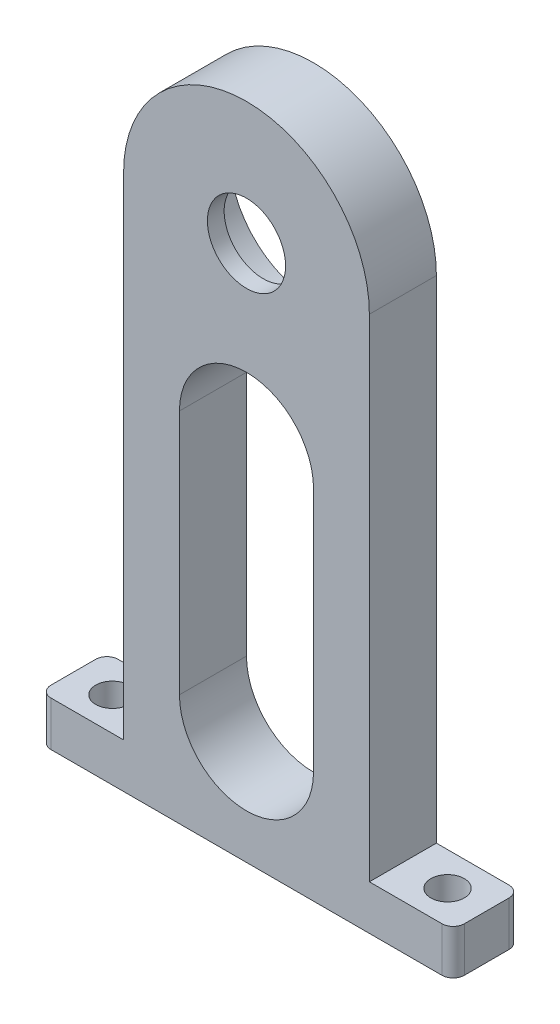
ISO-10303-21;
HEADER;
FILE_DESCRIPTION(('STEP AP214'),'2;1');
FILE_NAME('part.step','',(''),(''),'','','');
FILE_SCHEMA(('AUTOMOTIVE_DESIGN { 1 0 10303 214 1 1 1 1 }'));
ENDSEC;
DATA;
#1=APPLICATION_CONTEXT('core data for automotive mechanical design processes');
#2=APPLICATION_PROTOCOL_DEFINITION('international standard','automotive_design',2000,#1);
#3=PRODUCT_CONTEXT('',#1,'mechanical');
#4=PRODUCT('Part','Part','',(#3));
#5=PRODUCT_RELATED_PRODUCT_CATEGORY('part','',(#4));
#6=PRODUCT_DEFINITION_FORMATION('','',#4);
#7=PRODUCT_DEFINITION_CONTEXT('part definition',#1,'design');
#8=PRODUCT_DEFINITION('design','',#6,#7);
#9=PRODUCT_DEFINITION_SHAPE('','',#8);
#10=(LENGTH_UNIT() NAMED_UNIT(*) SI_UNIT(.MILLI.,.METRE.));
#11=(NAMED_UNIT(*) PLANE_ANGLE_UNIT() SI_UNIT($,.RADIAN.));
#12=(NAMED_UNIT(*) SI_UNIT($,.STERADIAN.) SOLID_ANGLE_UNIT());
#13=UNCERTAINTY_MEASURE_WITH_UNIT(LENGTH_MEASURE(1.E-05),#10,'distance_accuracy_value','');
#14=(GEOMETRIC_REPRESENTATION_CONTEXT(3) GLOBAL_UNCERTAINTY_ASSIGNED_CONTEXT((#13)) GLOBAL_UNIT_ASSIGNED_CONTEXT((#10,
#11,#12)) REPRESENTATION_CONTEXT('',''));
#15=CARTESIAN_POINT('',(0.,0.,0.));
#16=DIRECTION('',(0.,0.,1.));
#17=DIRECTION('',(1.,0.,0.));
#18=AXIS2_PLACEMENT_3D('',#15,#16,#17);
#19=CARTESIAN_POINT('',(22.,0.,12.));
#20=DIRECTION('',(1.,0.,0.));
#21=DIRECTION('',(0.,1.,0.));
#22=AXIS2_PLACEMENT_3D('',#19,#20,#21);
#23=PLANE('',#22);
#24=DIRECTION('',(0.,-1.,0.));
#25=VECTOR('',#24,1.);
#26=CARTESIAN_POINT('',(22.,0.,0.));
#27=LINE('',#26,#25);
#28=CARTESIAN_POINT('',(22.,0.,0.));
#29=VERTEX_POINT('',#28);
#30=CARTESIAN_POINT('',(22.,-88.,0.));
#31=VERTEX_POINT('',#30);
#32=EDGE_CURVE('E212',#29,#31,#27,.T.);
#33=ORIENTED_EDGE('',*,*,#32,.F.);
#34=DIRECTION('',(0.,0.,-1.));
#35=VECTOR('',#34,1.);
#36=CARTESIAN_POINT('',(22.,0.,12.));
#37=LINE('',#36,#35);
#38=CARTESIAN_POINT('',(22.,0.,12.));
#39=VERTEX_POINT('',#38);
#40=EDGE_CURVE('E244',#39,#29,#37,.T.);
#41=ORIENTED_EDGE('',*,*,#40,.F.);
#42=DIRECTION('',(0.,-1.,0.));
#43=VECTOR('',#42,1.);
#44=CARTESIAN_POINT('',(22.,0.,12.));
#45=LINE('',#44,#43);
#46=CARTESIAN_POINT('',(22.,-88.,12.));
#47=VERTEX_POINT('',#46);
#48=EDGE_CURVE('E183',#39,#47,#45,.T.);
#49=ORIENTED_EDGE('',*,*,#48,.T.);
#50=DIRECTION('',(0.,0.,-1.));
#51=VECTOR('',#50,1.);
#52=CARTESIAN_POINT('',(22.,-88.,12.));
#53=LINE('',#52,#51);
#54=EDGE_CURVE('E161',#47,#31,#53,.T.);
#55=ORIENTED_EDGE('',*,*,#54,.T.);
#56=EDGE_LOOP('',(#33,#41,#49,#55));
#57=FACE_BOUND('',#56,.T.);
#58=ADVANCED_FACE('F38',(#57),#23,.T.);
#59=CARTESIAN_POINT('',(0.,0.,12.));
#60=DIRECTION('',(0.,0.,-1.));
#61=DIRECTION('',(-1.,0.,0.));
#62=AXIS2_PLACEMENT_3D('',#59,#60,#61);
#63=CYLINDRICAL_SURFACE('',#62,22.);
#64=CARTESIAN_POINT('',(0.,0.,0.));
#65=DIRECTION('',(0.,0.,1.));
#66=DIRECTION('',(1.,0.,0.));
#67=AXIS2_PLACEMENT_3D('',#64,#65,#66);
#68=CIRCLE('',#67,22.);
#69=CARTESIAN_POINT('',(-22.,0.,0.));
#70=VERTEX_POINT('',#69);
#71=EDGE_CURVE('E215',#29,#70,#68,.T.);
#72=ORIENTED_EDGE('',*,*,#71,.T.);
#73=DIRECTION('',(0.,0.,-1.));
#74=VECTOR('',#73,1.);
#75=CARTESIAN_POINT('',(-22.,0.,12.));
#76=LINE('',#75,#74);
#77=CARTESIAN_POINT('',(-22.,0.,12.));
#78=VERTEX_POINT('',#77);
#79=EDGE_CURVE('E242',#78,#70,#76,.T.);
#80=ORIENTED_EDGE('',*,*,#79,.F.);
#81=CARTESIAN_POINT('',(0.,0.,12.));
#82=DIRECTION('',(0.,0.,1.));
#83=DIRECTION('',(1.,0.,0.));
#84=AXIS2_PLACEMENT_3D('',#81,#82,#83);
#85=CIRCLE('',#84,22.);
#86=EDGE_CURVE('E186',#39,#78,#85,.T.);
#87=ORIENTED_EDGE('',*,*,#86,.F.);
#88=ORIENTED_EDGE('',*,*,#40,.T.);
#89=EDGE_LOOP('',(#72,#80,#87,#88));
#90=FACE_BOUND('',#89,.T.);
#91=ADVANCED_FACE('F316',(#90),#63,.T.);
#92=CARTESIAN_POINT('',(-22.,0.,12.));
#93=DIRECTION('',(-1.,0.,0.));
#94=DIRECTION('',(0.,0.,1.));
#95=AXIS2_PLACEMENT_3D('',#92,#93,#94);
#96=PLANE('',#95);
#97=DIRECTION('',(0.,1.,0.));
#98=VECTOR('',#97,1.);
#99=CARTESIAN_POINT('',(-22.,0.,0.));
#100=LINE('',#99,#98);
#101=CARTESIAN_POINT('',(-22.,-88.,0.));
#102=VERTEX_POINT('',#101);
#103=EDGE_CURVE('E218',#102,#70,#100,.T.);
#104=ORIENTED_EDGE('',*,*,#103,.F.);
#105=DIRECTION('',(0.,0.,-1.));
#106=VECTOR('',#105,1.);
#107=CARTESIAN_POINT('',(-22.,-88.,12.));
#108=LINE('',#107,#106);
#109=CARTESIAN_POINT('',(-22.,-88.,12.));
#110=VERTEX_POINT('',#109);
#111=EDGE_CURVE('E239',#110,#102,#108,.T.);
#112=ORIENTED_EDGE('',*,*,#111,.F.);
#113=DIRECTION('',(0.,1.,0.));
#114=VECTOR('',#113,1.);
#115=CARTESIAN_POINT('',(-22.,0.,12.));
#116=LINE('',#115,#114);
#117=EDGE_CURVE('E188',#110,#78,#116,.T.);
#118=ORIENTED_EDGE('',*,*,#117,.T.);
#119=ORIENTED_EDGE('',*,*,#79,.T.);
#120=EDGE_LOOP('',(#104,#112,#118,#119));
#121=FACE_BOUND('',#120,.T.);
#122=ADVANCED_FACE('F321',(#121),#96,.T.);
#123=CARTESIAN_POINT('',(0.,-88.,12.));
#124=DIRECTION('',(0.,1.,0.));
#125=DIRECTION('',(0.,0.,1.));
#126=AXIS2_PLACEMENT_3D('',#123,#124,#125);
#127=PLANE('',#126);
#128=CARTESIAN_POINT('',(-30.,-88.,6.));
#129=DIRECTION('',(0.,1.,0.));
#130=DIRECTION('',(0.,0.,1.));
#131=AXIS2_PLACEMENT_3D('',#128,#129,#130);
#132=CIRCLE('',#131,3.);
#133=CARTESIAN_POINT('',(-30.,-88.,9.));
#134=VERTEX_POINT('',#133);
#135=EDGE_CURVE('E204',#134,#134,#132,.T.);
#136=ORIENTED_EDGE('',*,*,#135,.F.);
#137=EDGE_LOOP('',(#136));
#138=FACE_BOUND('',#137,.T.);
#139=DIRECTION('',(1.,0.,0.));
#140=VECTOR('',#139,1.);
#141=CARTESIAN_POINT('',(0.,-88.,0.));
#142=LINE('',#141,#140);
#143=CARTESIAN_POINT('',(-35.,-88.,0.));
#144=VERTEX_POINT('',#143);
#145=EDGE_CURVE('E221',#144,#102,#142,.T.);
#146=ORIENTED_EDGE('',*,*,#145,.F.);
#147=CARTESIAN_POINT('',(-35.,-88.,2.));
#148=DIRECTION('',(0.,1.,0.));
#149=DIRECTION('',(0.,0.,1.));
#150=AXIS2_PLACEMENT_3D('',#147,#148,#149);
#151=CIRCLE('',#150,2.);
#152=CARTESIAN_POINT('',(-37.,-88.,2.));
#153=VERTEX_POINT('',#152);
#154=EDGE_CURVE('E262',#144,#153,#151,.T.);
#155=ORIENTED_EDGE('',*,*,#154,.T.);
#156=DIRECTION('',(0.,0.,-1.));
#157=VECTOR('',#156,1.);
#158=CARTESIAN_POINT('',(-37.,-88.,12.));
#159=LINE('',#158,#157);
#160=CARTESIAN_POINT('',(-37.,-88.,10.));
#161=VERTEX_POINT('',#160);
#162=EDGE_CURVE('E236',#161,#153,#159,.T.);
#163=ORIENTED_EDGE('',*,*,#162,.F.);
#164=CARTESIAN_POINT('',(-35.,-88.,10.));
#165=DIRECTION('',(0.,1.,0.));
#166=DIRECTION('',(0.,0.,1.));
#167=AXIS2_PLACEMENT_3D('',#164,#165,#166);
#168=CIRCLE('',#167,2.);
#169=CARTESIAN_POINT('',(-35.,-88.,12.));
#170=VERTEX_POINT('',#169);
#171=EDGE_CURVE('E260',#161,#170,#168,.T.);
#172=ORIENTED_EDGE('',*,*,#171,.T.);
#173=DIRECTION('',(1.,0.,0.));
#174=VECTOR('',#173,1.);
#175=CARTESIAN_POINT('',(0.,-88.,12.));
#176=LINE('',#175,#174);
#177=EDGE_CURVE('E191',#170,#110,#176,.T.);
#178=ORIENTED_EDGE('',*,*,#177,.T.);
#179=ORIENTED_EDGE('',*,*,#111,.T.);
#180=EDGE_LOOP('',(#146,#155,#163,#172,#178,#179));
#181=FACE_BOUND('',#180,.T.);
#182=ADVANCED_FACE('F359',(#138,#181),#127,.T.);
#183=CARTESIAN_POINT('',(-37.,0.,12.));
#184=DIRECTION('',(-1.,0.,0.));
#185=DIRECTION('',(0.,0.,1.));
#186=AXIS2_PLACEMENT_3D('',#183,#184,#185);
#187=PLANE('',#186);
#188=ORIENTED_EDGE('',*,*,#162,.T.);
#189=DIRECTION('',(0.,1.,0.));
#190=VECTOR('',#189,1.);
#191=CARTESIAN_POINT('',(-37.,-96.,2.));
#192=LINE('',#191,#190);
#193=CARTESIAN_POINT('',(-37.,-96.,2.));
#194=VERTEX_POINT('',#193);
#195=EDGE_CURVE('E267',#153,#194,#192,.F.);
#196=ORIENTED_EDGE('',*,*,#195,.T.);
#197=DIRECTION('',(0.,0.,-1.));
#198=VECTOR('',#197,1.);
#199=CARTESIAN_POINT('',(-37.,-96.,12.));
#200=LINE('',#199,#198);
#201=CARTESIAN_POINT('',(-37.,-96.,10.));
#202=VERTEX_POINT('',#201);
#203=EDGE_CURVE('E233',#202,#194,#200,.T.);
#204=ORIENTED_EDGE('',*,*,#203,.F.);
#205=DIRECTION('',(0.,1.,0.));
#206=VECTOR('',#205,1.);
#207=CARTESIAN_POINT('',(-37.,0.,10.));
#208=LINE('',#207,#206);
#209=EDGE_CURVE('E264',#202,#161,#208,.T.);
#210=ORIENTED_EDGE('',*,*,#209,.T.);
#211=EDGE_LOOP('',(#188,#196,#204,#210));
#212=FACE_BOUND('',#211,.T.);
#213=ADVANCED_FACE('F354',(#212),#187,.T.);
#214=CARTESIAN_POINT('',(0.,-96.,12.));
#215=DIRECTION('',(0.,-1.,0.));
#216=DIRECTION('',(0.,0.,-1.));
#217=AXIS2_PLACEMENT_3D('',#214,#215,#216);
#218=PLANE('',#217);
#219=CARTESIAN_POINT('',(-30.,-96.,6.));
#220=DIRECTION('',(0.,-1.,0.));
#221=DIRECTION('',(0.,0.,-1.));
#222=AXIS2_PLACEMENT_3D('',#219,#220,#221);
#223=CIRCLE('',#222,3.);
#224=CARTESIAN_POINT('',(-30.,-96.,3.));
#225=VERTEX_POINT('',#224);
#226=EDGE_CURVE('E254',#225,#225,#223,.T.);
#227=ORIENTED_EDGE('',*,*,#226,.F.);
#228=EDGE_LOOP('',(#227));
#229=FACE_BOUND('',#228,.T.);
#230=CARTESIAN_POINT('',(30.,-96.,6.));
#231=DIRECTION('',(0.,-1.,0.));
#232=DIRECTION('',(0.,0.,-1.));
#233=AXIS2_PLACEMENT_3D('',#230,#231,#232);
#234=CIRCLE('',#233,3.);
#235=CARTESIAN_POINT('',(30.,-96.,3.));
#236=VERTEX_POINT('',#235);
#237=EDGE_CURVE('E413',#236,#236,#234,.T.);
#238=ORIENTED_EDGE('',*,*,#237,.F.);
#239=EDGE_LOOP('',(#238));
#240=FACE_BOUND('',#239,.T.);
#241=ORIENTED_EDGE('',*,*,#203,.T.);
#242=CARTESIAN_POINT('',(-35.,-96.,2.));
#243=DIRECTION('',(0.,-1.,0.));
#244=DIRECTION('',(0.,0.,-1.));
#245=AXIS2_PLACEMENT_3D('',#242,#243,#244);
#246=CIRCLE('',#245,2.);
#247=CARTESIAN_POINT('',(-35.,-96.,0.));
#248=VERTEX_POINT('',#247);
#249=EDGE_CURVE('E275',#194,#248,#246,.T.);
#250=ORIENTED_EDGE('',*,*,#249,.T.);
#251=DIRECTION('',(-1.,0.,0.));
#252=VECTOR('',#251,1.);
#253=CARTESIAN_POINT('',(0.,-96.,0.));
#254=LINE('',#253,#252);
#255=CARTESIAN_POINT('',(35.,-96.,0.));
#256=VERTEX_POINT('',#255);
#257=EDGE_CURVE('E223',#256,#248,#254,.T.);
#258=ORIENTED_EDGE('',*,*,#257,.F.);
#259=CARTESIAN_POINT('',(35.,-96.,2.));
#260=DIRECTION('',(0.,-1.,0.));
#261=DIRECTION('',(0.,0.,-1.));
#262=AXIS2_PLACEMENT_3D('',#259,#260,#261);
#263=CIRCLE('',#262,2.);
#264=CARTESIAN_POINT('',(37.,-96.,2.));
#265=VERTEX_POINT('',#264);
#266=EDGE_CURVE('E271',#256,#265,#263,.T.);
#267=ORIENTED_EDGE('',*,*,#266,.T.);
#268=DIRECTION('',(0.,0.,-1.));
#269=VECTOR('',#268,1.);
#270=CARTESIAN_POINT('',(37.,-96.,12.));
#271=LINE('',#270,#269);
#272=CARTESIAN_POINT('',(37.,-96.,10.));
#273=VERTEX_POINT('',#272);
#274=EDGE_CURVE('E231',#273,#265,#271,.T.);
#275=ORIENTED_EDGE('',*,*,#274,.F.);
#276=CARTESIAN_POINT('',(35.,-96.,10.));
#277=DIRECTION('',(0.,-1.,0.));
#278=DIRECTION('',(0.,0.,-1.));
#279=AXIS2_PLACEMENT_3D('',#276,#277,#278);
#280=CIRCLE('',#279,2.);
#281=CARTESIAN_POINT('',(35.,-96.,12.));
#282=VERTEX_POINT('',#281);
#283=EDGE_CURVE('E269',#273,#282,#280,.T.);
#284=ORIENTED_EDGE('',*,*,#283,.T.);
#285=DIRECTION('',(-1.,0.,0.));
#286=VECTOR('',#285,1.);
#287=CARTESIAN_POINT('',(0.,-96.,12.));
#288=LINE('',#287,#286);
#289=CARTESIAN_POINT('',(-35.,-96.,12.));
#290=VERTEX_POINT('',#289);
#291=EDGE_CURVE('E193',#282,#290,#288,.T.);
#292=ORIENTED_EDGE('',*,*,#291,.T.);
#293=CARTESIAN_POINT('',(-35.,-96.,10.));
#294=DIRECTION('',(0.,-1.,0.));
#295=DIRECTION('',(0.,0.,-1.));
#296=AXIS2_PLACEMENT_3D('',#293,#294,#295);
#297=CIRCLE('',#296,2.);
#298=EDGE_CURVE('E273',#290,#202,#297,.T.);
#299=ORIENTED_EDGE('',*,*,#298,.T.);
#300=EDGE_LOOP('',(#241,#250,#258,#267,#275,#284,#292,#299));
#301=FACE_BOUND('',#300,.T.);
#302=ADVANCED_FACE('F289',(#229,#240,#301),#218,.T.);
#303=CARTESIAN_POINT('',(37.0000000000001,0.,12.));
#304=DIRECTION('',(1.,0.,0.));
#305=DIRECTION('',(0.,1.,0.));
#306=AXIS2_PLACEMENT_3D('',#303,#304,#305);
#307=PLANE('',#306);
#308=ORIENTED_EDGE('',*,*,#274,.T.);
#309=DIRECTION('',(0.,-1.,0.));
#310=VECTOR('',#309,1.);
#311=CARTESIAN_POINT('',(37.,-88.,2.));
#312=LINE('',#311,#310);
#313=CARTESIAN_POINT('',(37.,-88.,2.));
#314=VERTEX_POINT('',#313);
#315=EDGE_CURVE('E53',#265,#314,#312,.F.);
#316=ORIENTED_EDGE('',*,*,#315,.T.);
#317=DIRECTION('',(0.,0.,-1.));
#318=VECTOR('',#317,1.);
#319=CARTESIAN_POINT('',(37.,-88.,12.));
#320=LINE('',#319,#318);
#321=CARTESIAN_POINT('',(37.,-88.,10.));
#322=VERTEX_POINT('',#321);
#323=EDGE_CURVE('E229',#322,#314,#320,.T.);
#324=ORIENTED_EDGE('',*,*,#323,.F.);
#325=DIRECTION('',(0.,-1.,0.));
#326=VECTOR('',#325,1.);
#327=CARTESIAN_POINT('',(37.0000000000001,0.,10.));
#328=LINE('',#327,#326);
#329=EDGE_CURVE('E281',#322,#273,#328,.T.);
#330=ORIENTED_EDGE('',*,*,#329,.T.);
#331=EDGE_LOOP('',(#308,#316,#324,#330));
#332=FACE_BOUND('',#331,.T.);
#333=ADVANCED_FACE('F286',(#332),#307,.T.);
#334=CARTESIAN_POINT('',(0.,-76.,12.));
#335=DIRECTION('',(0.,0.,-1.));
#336=DIRECTION('',(-1.,0.,0.));
#337=AXIS2_PLACEMENT_3D('',#334,#335,#336);
#338=CYLINDRICAL_SURFACE('',#337,12.);
#339=CARTESIAN_POINT('',(0.,-76.,0.));
#340=DIRECTION('',(0.,0.,1.));
#341=DIRECTION('',(1.,0.,0.));
#342=AXIS2_PLACEMENT_3D('',#339,#340,#341);
#343=CIRCLE('',#342,12.);
#344=CARTESIAN_POINT('',(-12.,-76.,0.));
#345=VERTEX_POINT('',#344);
#346=CARTESIAN_POINT('',(12.,-76.,0.));
#347=VERTEX_POINT('',#346);
#348=EDGE_CURVE('E156',#345,#347,#343,.T.);
#349=ORIENTED_EDGE('',*,*,#348,.F.);
#350=DIRECTION('',(0.,0.,-1.));
#351=VECTOR('',#350,1.);
#352=CARTESIAN_POINT('',(-12.,-76.,12.));
#353=LINE('',#352,#351);
#354=CARTESIAN_POINT('',(-12.,-76.,12.));
#355=VERTEX_POINT('',#354);
#356=EDGE_CURVE('E151',#355,#345,#353,.T.);
#357=ORIENTED_EDGE('',*,*,#356,.F.);
#358=CARTESIAN_POINT('',(0.,-76.,12.));
#359=DIRECTION('',(0.,0.,1.));
#360=DIRECTION('',(1.,0.,0.));
#361=AXIS2_PLACEMENT_3D('',#358,#359,#360);
#362=CIRCLE('',#361,12.);
#363=CARTESIAN_POINT('',(12.,-76.,12.));
#364=VERTEX_POINT('',#363);
#365=EDGE_CURVE('E154',#355,#364,#362,.T.);
#366=ORIENTED_EDGE('',*,*,#365,.T.);
#367=DIRECTION('',(0.,0.,-1.));
#368=VECTOR('',#367,1.);
#369=CARTESIAN_POINT('',(12.,-76.,12.));
#370=LINE('',#369,#368);
#371=EDGE_CURVE('E201',#364,#347,#370,.T.);
#372=ORIENTED_EDGE('',*,*,#371,.T.);
#373=EDGE_LOOP('',(#349,#357,#366,#372));
#374=FACE_BOUND('',#373,.T.);
#375=ADVANCED_FACE('F153',(#374),#338,.F.);
#376=CARTESIAN_POINT('',(-12.,0.,12.));
#377=DIRECTION('',(1.,0.,0.));
#378=DIRECTION('',(0.,1.,0.));
#379=AXIS2_PLACEMENT_3D('',#376,#377,#378);
#380=PLANE('',#379);
#381=DIRECTION('',(0.,-1.,0.));
#382=VECTOR('',#381,1.);
#383=CARTESIAN_POINT('',(-12.,0.,0.));
#384=LINE('',#383,#382);
#385=CARTESIAN_POINT('',(-12.,-32.,0.));
#386=VERTEX_POINT('',#385);
#387=EDGE_CURVE('E203',#386,#345,#384,.T.);
#388=ORIENTED_EDGE('',*,*,#387,.F.);
#389=DIRECTION('',(0.,0.,-1.));
#390=VECTOR('',#389,1.);
#391=CARTESIAN_POINT('',(-12.,-32.,12.));
#392=LINE('',#391,#390);
#393=CARTESIAN_POINT('',(-12.,-32.,12.));
#394=VERTEX_POINT('',#393);
#395=EDGE_CURVE('E162',#394,#386,#392,.T.);
#396=ORIENTED_EDGE('',*,*,#395,.F.);
#397=DIRECTION('',(0.,-1.,0.));
#398=VECTOR('',#397,1.);
#399=CARTESIAN_POINT('',(-12.,0.,12.));
#400=LINE('',#399,#398);
#401=EDGE_CURVE('E169',#394,#355,#400,.T.);
#402=ORIENTED_EDGE('',*,*,#401,.T.);
#403=ORIENTED_EDGE('',*,*,#356,.T.);
#404=EDGE_LOOP('',(#388,#396,#402,#403));
#405=FACE_BOUND('',#404,.T.);
#406=ADVANCED_FACE('F176',(#405),#380,.T.);
#407=CARTESIAN_POINT('',(0.,-32.,12.));
#408=DIRECTION('',(0.,0.,-1.));
#409=DIRECTION('',(-1.,0.,0.));
#410=AXIS2_PLACEMENT_3D('',#407,#408,#409);
#411=CYLINDRICAL_SURFACE('',#410,12.);
#412=CARTESIAN_POINT('',(0.,-32.,0.));
#413=DIRECTION('',(0.,0.,1.));
#414=DIRECTION('',(1.,0.,0.));
#415=AXIS2_PLACEMENT_3D('',#412,#413,#414);
#416=CIRCLE('',#415,12.);
#417=CARTESIAN_POINT('',(12.,-32.,0.));
#418=VERTEX_POINT('',#417);
#419=EDGE_CURVE('E206',#418,#386,#416,.T.);
#420=ORIENTED_EDGE('',*,*,#419,.F.);
#421=DIRECTION('',(0.,0.,-1.));
#422=VECTOR('',#421,1.);
#423=CARTESIAN_POINT('',(12.,-32.,12.));
#424=LINE('',#423,#422);
#425=CARTESIAN_POINT('',(12.,-32.,12.));
#426=VERTEX_POINT('',#425);
#427=EDGE_CURVE('E248',#426,#418,#424,.T.);
#428=ORIENTED_EDGE('',*,*,#427,.F.);
#429=CARTESIAN_POINT('',(0.,-32.,12.));
#430=DIRECTION('',(0.,0.,1.));
#431=DIRECTION('',(1.,0.,0.));
#432=AXIS2_PLACEMENT_3D('',#429,#430,#431);
#433=CIRCLE('',#432,12.);
#434=EDGE_CURVE('E177',#426,#394,#433,.T.);
#435=ORIENTED_EDGE('',*,*,#434,.T.);
#436=ORIENTED_EDGE('',*,*,#395,.T.);
#437=EDGE_LOOP('',(#420,#428,#435,#436));
#438=FACE_BOUND('',#437,.T.);
#439=ADVANCED_FACE('F331',(#438),#411,.F.);
#440=CARTESIAN_POINT('',(0.,-88.,12.));
#441=DIRECTION('',(0.,1.,0.));
#442=DIRECTION('',(0.,0.,1.));
#443=AXIS2_PLACEMENT_3D('',#440,#441,#442);
#444=PLANE('',#443);
#445=CARTESIAN_POINT('',(30.,-88.,6.));
#446=DIRECTION('',(0.,1.,0.));
#447=DIRECTION('',(0.,0.,1.));
#448=AXIS2_PLACEMENT_3D('',#445,#446,#447);
#449=CIRCLE('',#448,3.);
#450=CARTESIAN_POINT('',(30.,-88.,9.));
#451=VERTEX_POINT('',#450);
#452=EDGE_CURVE('E251',#451,#451,#449,.T.);
#453=ORIENTED_EDGE('',*,*,#452,.F.);
#454=EDGE_LOOP('',(#453));
#455=FACE_BOUND('',#454,.T.);
#456=ORIENTED_EDGE('',*,*,#323,.T.);
#457=CARTESIAN_POINT('',(35.,-88.,2.));
#458=DIRECTION('',(0.,1.,0.));
#459=DIRECTION('',(0.,0.,1.));
#460=AXIS2_PLACEMENT_3D('',#457,#458,#459);
#461=CIRCLE('',#460,2.);
#462=CARTESIAN_POINT('',(35.,-88.,0.));
#463=VERTEX_POINT('',#462);
#464=EDGE_CURVE('E11',#314,#463,#461,.T.);
#465=ORIENTED_EDGE('',*,*,#464,.T.);
#466=DIRECTION('',(1.,0.,0.));
#467=VECTOR('',#466,1.);
#468=CARTESIAN_POINT('',(0.,-88.,0.));
#469=LINE('',#468,#467);
#470=EDGE_CURVE('E174',#31,#463,#469,.T.);
#471=ORIENTED_EDGE('',*,*,#470,.F.);
#472=ORIENTED_EDGE('',*,*,#54,.F.);
#473=DIRECTION('',(1.,0.,0.));
#474=VECTOR('',#473,1.);
#475=CARTESIAN_POINT('',(0.,-88.,12.));
#476=LINE('',#475,#474);
#477=CARTESIAN_POINT('',(35.,-88.,12.));
#478=VERTEX_POINT('',#477);
#479=EDGE_CURVE('E196',#47,#478,#476,.T.);
#480=ORIENTED_EDGE('',*,*,#479,.T.);
#481=CARTESIAN_POINT('',(35.,-88.,10.));
#482=DIRECTION('',(0.,1.,0.));
#483=DIRECTION('',(0.,0.,1.));
#484=AXIS2_PLACEMENT_3D('',#481,#482,#483);
#485=CIRCLE('',#484,2.);
#486=EDGE_CURVE('E46',#478,#322,#485,.T.);
#487=ORIENTED_EDGE('',*,*,#486,.T.);
#488=EDGE_LOOP('',(#456,#465,#471,#472,#480,#487));
#489=FACE_BOUND('',#488,.T.);
#490=ADVANCED_FACE('F302',(#455,#489),#444,.T.);
#491=CARTESIAN_POINT('',(12.,0.,12.));
#492=DIRECTION('',(1.,0.,0.));
#493=DIRECTION('',(0.,1.,0.));
#494=AXIS2_PLACEMENT_3D('',#491,#492,#493);
#495=PLANE('',#494);
#496=DIRECTION('',(0.,-1.,0.));
#497=VECTOR('',#496,1.);
#498=CARTESIAN_POINT('',(12.,0.,0.));
#499=LINE('',#498,#497);
#500=EDGE_CURVE('E209',#418,#347,#499,.T.);
#501=ORIENTED_EDGE('',*,*,#500,.T.);
#502=ORIENTED_EDGE('',*,*,#371,.F.);
#503=DIRECTION('',(0.,-1.,0.));
#504=VECTOR('',#503,1.);
#505=CARTESIAN_POINT('',(12.,0.,12.));
#506=LINE('',#505,#504);
#507=EDGE_CURVE('E172',#426,#364,#506,.T.);
#508=ORIENTED_EDGE('',*,*,#507,.F.);
#509=ORIENTED_EDGE('',*,*,#427,.T.);
#510=EDGE_LOOP('',(#501,#502,#508,#509));
#511=FACE_BOUND('',#510,.T.);
#512=ADVANCED_FACE('F326',(#511),#495,.F.);
#513=CARTESIAN_POINT('',(0.,0.,12.));
#514=DIRECTION('',(0.,0.,-1.));
#515=DIRECTION('',(-1.,0.,0.));
#516=AXIS2_PLACEMENT_3D('',#513,#514,#515);
#517=CYLINDRICAL_SURFACE('',#516,7.);
#518=CARTESIAN_POINT('',(0.,0.,9.));
#519=DIRECTION('',(0.,0.,1.));
#520=DIRECTION('',(1.,0.,0.));
#521=AXIS2_PLACEMENT_3D('',#518,#519,#520);
#522=CIRCLE('',#521,7.);
#523=CARTESIAN_POINT('',(7.,0.,9.));
#524=VERTEX_POINT('',#523);
#525=EDGE_CURVE('E409',#524,#524,#522,.T.);
#526=ORIENTED_EDGE('',*,*,#525,.F.);
#527=EDGE_LOOP('',(#526));
#528=FACE_BOUND('',#527,.T.);
#529=CARTESIAN_POINT('',(0.,0.,12.));
#530=DIRECTION('',(0.,0.,1.));
#531=DIRECTION('',(1.,0.,0.));
#532=AXIS2_PLACEMENT_3D('',#529,#530,#531);
#533=CIRCLE('',#532,7.);
#534=CARTESIAN_POINT('',(7.,0.,12.));
#535=VERTEX_POINT('',#534);
#536=EDGE_CURVE('E198',#535,#535,#533,.T.);
#537=ORIENTED_EDGE('',*,*,#536,.T.);
#538=EDGE_LOOP('',(#537));
#539=FACE_BOUND('',#538,.T.);
#540=ADVANCED_FACE('F329',(#528,#539),#517,.F.);
#541=CARTESIAN_POINT('',(0.,0.,12.));
#542=DIRECTION('',(0.,0.,1.));
#543=DIRECTION('',(1.,0.,0.));
#544=AXIS2_PLACEMENT_3D('',#541,#542,#543);
#545=PLANE('',#544);
#546=ORIENTED_EDGE('',*,*,#365,.F.);
#547=ORIENTED_EDGE('',*,*,#401,.F.);
#548=ORIENTED_EDGE('',*,*,#434,.F.);
#549=ORIENTED_EDGE('',*,*,#507,.T.);
#550=EDGE_LOOP('',(#546,#547,#548,#549));
#551=FACE_BOUND('',#550,.T.);
#552=ORIENTED_EDGE('',*,*,#177,.F.);
#553=DIRECTION('',(0.,1.,0.));
#554=VECTOR('',#553,1.);
#555=CARTESIAN_POINT('',(-35.,0.,12.));
#556=LINE('',#555,#554);
#557=EDGE_CURVE('E279',#170,#290,#556,.F.);
#558=ORIENTED_EDGE('',*,*,#557,.T.);
#559=ORIENTED_EDGE('',*,*,#291,.F.);
#560=DIRECTION('',(0.,-1.,0.));
#561=VECTOR('',#560,1.);
#562=CARTESIAN_POINT('',(35.0000000000001,0.,12.));
#563=LINE('',#562,#561);
#564=EDGE_CURVE('E277',#282,#478,#563,.F.);
#565=ORIENTED_EDGE('',*,*,#564,.T.);
#566=ORIENTED_EDGE('',*,*,#479,.F.);
#567=ORIENTED_EDGE('',*,*,#48,.F.);
#568=ORIENTED_EDGE('',*,*,#86,.T.);
#569=ORIENTED_EDGE('',*,*,#117,.F.);
#570=EDGE_LOOP('',(#552,#558,#559,#565,#566,#567,#568,#569));
#571=FACE_BOUND('',#570,.T.);
#572=ORIENTED_EDGE('',*,*,#536,.F.);
#573=EDGE_LOOP('',(#572));
#574=FACE_BOUND('',#573,.T.);
#575=ADVANCED_FACE('F166',(#551,#571,#574),#545,.T.);
#576=CARTESIAN_POINT('',(0.,0.,0.));
#577=DIRECTION('',(0.,0.,1.));
#578=DIRECTION('',(1.,0.,0.));
#579=AXIS2_PLACEMENT_3D('',#576,#577,#578);
#580=PLANE('',#579);
#581=CARTESIAN_POINT('',(0.,0.,0.));
#582=DIRECTION('',(0.,0.,1.));
#583=DIRECTION('',(1.,0.,0.));
#584=AXIS2_PLACEMENT_3D('',#581,#582,#583);
#585=CIRCLE('',#584,15.);
#586=CARTESIAN_POINT('',(15.,0.,0.));
#587=VERTEX_POINT('',#586);
#588=EDGE_CURVE('E417',#587,#587,#585,.T.);
#589=ORIENTED_EDGE('',*,*,#588,.T.);
#590=EDGE_LOOP('',(#589));
#591=FACE_BOUND('',#590,.T.);
#592=ORIENTED_EDGE('',*,*,#348,.T.);
#593=ORIENTED_EDGE('',*,*,#500,.F.);
#594=ORIENTED_EDGE('',*,*,#419,.T.);
#595=ORIENTED_EDGE('',*,*,#387,.T.);
#596=EDGE_LOOP('',(#592,#593,#594,#595));
#597=FACE_BOUND('',#596,.T.);
#598=ORIENTED_EDGE('',*,*,#257,.T.);
#599=DIRECTION('',(0.,1.,0.));
#600=VECTOR('',#599,1.);
#601=CARTESIAN_POINT('',(-35.,-88.,0.));
#602=LINE('',#601,#600);
#603=EDGE_CURVE('E257',#248,#144,#602,.T.);
#604=ORIENTED_EDGE('',*,*,#603,.T.);
#605=ORIENTED_EDGE('',*,*,#145,.T.);
#606=ORIENTED_EDGE('',*,*,#103,.T.);
#607=ORIENTED_EDGE('',*,*,#71,.F.);
#608=ORIENTED_EDGE('',*,*,#32,.T.);
#609=ORIENTED_EDGE('',*,*,#470,.T.);
#610=DIRECTION('',(0.,-1.,0.));
#611=VECTOR('',#610,1.);
#612=CARTESIAN_POINT('',(35.,-96.,0.));
#613=LINE('',#612,#611);
#614=EDGE_CURVE('E246',#463,#256,#613,.T.);
#615=ORIENTED_EDGE('',*,*,#614,.T.);
#616=EDGE_LOOP('',(#598,#604,#605,#606,#607,#608,#609,#615));
#617=FACE_BOUND('',#616,.T.);
#618=ADVANCED_FACE('F297',(#591,#597,#617),#580,.F.);
#619=CARTESIAN_POINT('',(30.,22.,6.));
#620=DIRECTION('',(0.,-1.,0.));
#621=DIRECTION('',(0.,0.,-1.));
#622=AXIS2_PLACEMENT_3D('',#619,#620,#621);
#623=CYLINDRICAL_SURFACE('',#622,3.);
#624=ORIENTED_EDGE('',*,*,#452,.T.);
#625=EDGE_LOOP('',(#624));
#626=FACE_BOUND('',#625,.T.);
#627=ORIENTED_EDGE('',*,*,#237,.T.);
#628=EDGE_LOOP('',(#627));
#629=FACE_BOUND('',#628,.T.);
#630=ADVANCED_FACE('F387',(#626,#629),#623,.F.);
#631=CARTESIAN_POINT('',(-30.,22.,6.));
#632=DIRECTION('',(0.,-1.,0.));
#633=DIRECTION('',(0.,0.,-1.));
#634=AXIS2_PLACEMENT_3D('',#631,#632,#633);
#635=CYLINDRICAL_SURFACE('',#634,3.);
#636=ORIENTED_EDGE('',*,*,#135,.T.);
#637=EDGE_LOOP('',(#636));
#638=FACE_BOUND('',#637,.T.);
#639=ORIENTED_EDGE('',*,*,#226,.T.);
#640=EDGE_LOOP('',(#639));
#641=FACE_BOUND('',#640,.T.);
#642=ADVANCED_FACE('F393',(#638,#641),#635,.F.);
#643=CARTESIAN_POINT('',(0.,0.,9.));
#644=DIRECTION('',(0.,0.,-1.));
#645=DIRECTION('',(-1.,0.,0.));
#646=AXIS2_PLACEMENT_3D('',#643,#644,#645);
#647=CYLINDRICAL_SURFACE('',#646,15.);
#648=CARTESIAN_POINT('',(0.,0.,9.));
#649=DIRECTION('',(0.,0.,1.));
#650=DIRECTION('',(1.,0.,0.));
#651=AXIS2_PLACEMENT_3D('',#648,#649,#650);
#652=CIRCLE('',#651,15.);
#653=CARTESIAN_POINT('',(15.,0.,9.));
#654=VERTEX_POINT('',#653);
#655=EDGE_CURVE('E412',#654,#654,#652,.T.);
#656=ORIENTED_EDGE('',*,*,#655,.T.);
#657=EDGE_LOOP('',(#656));
#658=FACE_BOUND('',#657,.T.);
#659=ORIENTED_EDGE('',*,*,#588,.F.);
#660=EDGE_LOOP('',(#659));
#661=FACE_BOUND('',#660,.T.);
#662=ADVANCED_FACE('F397',(#658,#661),#647,.F.);
#663=CARTESIAN_POINT('',(0.,0.,9.));
#664=DIRECTION('',(0.,0.,1.));
#665=DIRECTION('',(1.,0.,0.));
#666=AXIS2_PLACEMENT_3D('',#663,#664,#665);
#667=PLANE('',#666);
#668=ORIENTED_EDGE('',*,*,#525,.T.);
#669=EDGE_LOOP('',(#668));
#670=FACE_BOUND('',#669,.T.);
#671=ORIENTED_EDGE('',*,*,#655,.F.);
#672=EDGE_LOOP('',(#671));
#673=FACE_BOUND('',#672,.T.);
#674=ADVANCED_FACE('F342',(#670,#673),#667,.F.);
#675=CARTESIAN_POINT('',(-35.,0.,2.));
#676=DIRECTION('',(0.,-1.,0.));
#677=DIRECTION('',(0.,0.,-1.));
#678=AXIS2_PLACEMENT_3D('',#675,#676,#677);
#679=CYLINDRICAL_SURFACE('',#678,2.);
#680=ORIENTED_EDGE('',*,*,#249,.F.);
#681=ORIENTED_EDGE('',*,*,#195,.F.);
#682=ORIENTED_EDGE('',*,*,#154,.F.);
#683=ORIENTED_EDGE('',*,*,#603,.F.);
#684=EDGE_LOOP('',(#680,#681,#682,#683));
#685=FACE_BOUND('',#684,.T.);
#686=ADVANCED_FACE('F339',(#685),#679,.T.);
#687=CARTESIAN_POINT('',(-35.,0.,10.));
#688=DIRECTION('',(0.,1.,0.));
#689=DIRECTION('',(0.,0.,1.));
#690=AXIS2_PLACEMENT_3D('',#687,#688,#689);
#691=CYLINDRICAL_SURFACE('',#690,2.);
#692=ORIENTED_EDGE('',*,*,#298,.F.);
#693=ORIENTED_EDGE('',*,*,#557,.F.);
#694=ORIENTED_EDGE('',*,*,#171,.F.);
#695=ORIENTED_EDGE('',*,*,#209,.F.);
#696=EDGE_LOOP('',(#692,#693,#694,#695));
#697=FACE_BOUND('',#696,.T.);
#698=ADVANCED_FACE('F314',(#697),#691,.T.);
#699=CARTESIAN_POINT('',(35.0000000000001,0.,2.));
#700=DIRECTION('',(0.,1.,0.));
#701=DIRECTION('',(-1.,0.,0.));
#702=AXIS2_PLACEMENT_3D('',#699,#700,#701);
#703=CYLINDRICAL_SURFACE('',#702,2.);
#704=ORIENTED_EDGE('',*,*,#464,.F.);
#705=ORIENTED_EDGE('',*,*,#315,.F.);
#706=ORIENTED_EDGE('',*,*,#266,.F.);
#707=ORIENTED_EDGE('',*,*,#614,.F.);
#708=EDGE_LOOP('',(#704,#705,#706,#707));
#709=FACE_BOUND('',#708,.T.);
#710=ADVANCED_FACE('F295',(#709),#703,.T.);
#711=CARTESIAN_POINT('',(35.0000000000001,0.,10.));
#712=DIRECTION('',(0.,-1.,0.));
#713=DIRECTION('',(1.,0.,0.));
#714=AXIS2_PLACEMENT_3D('',#711,#712,#713);
#715=CYLINDRICAL_SURFACE('',#714,2.);
#716=ORIENTED_EDGE('',*,*,#486,.F.);
#717=ORIENTED_EDGE('',*,*,#564,.F.);
#718=ORIENTED_EDGE('',*,*,#283,.F.);
#719=ORIENTED_EDGE('',*,*,#329,.F.);
#720=EDGE_LOOP('',(#716,#717,#718,#719));
#721=FACE_BOUND('',#720,.T.);
#722=ADVANCED_FACE('F40',(#721),#715,.T.);
#723=CLOSED_SHELL('',(#58,#91,#122,#182,#213,#302,#333,#375,#406,#439,#490,#512,#540,#575,#618,
#630,#642,#662,#674,#686,#698,#710,#722));
#724=MANIFOLD_SOLID_BREP('B2',#723);
#725=ADVANCED_BREP_SHAPE_REPRESENTATION('',(#18,#724),#14);
#726=SHAPE_DEFINITION_REPRESENTATION(#9,#725);
ENDSEC;
END-ISO-10303-21;
